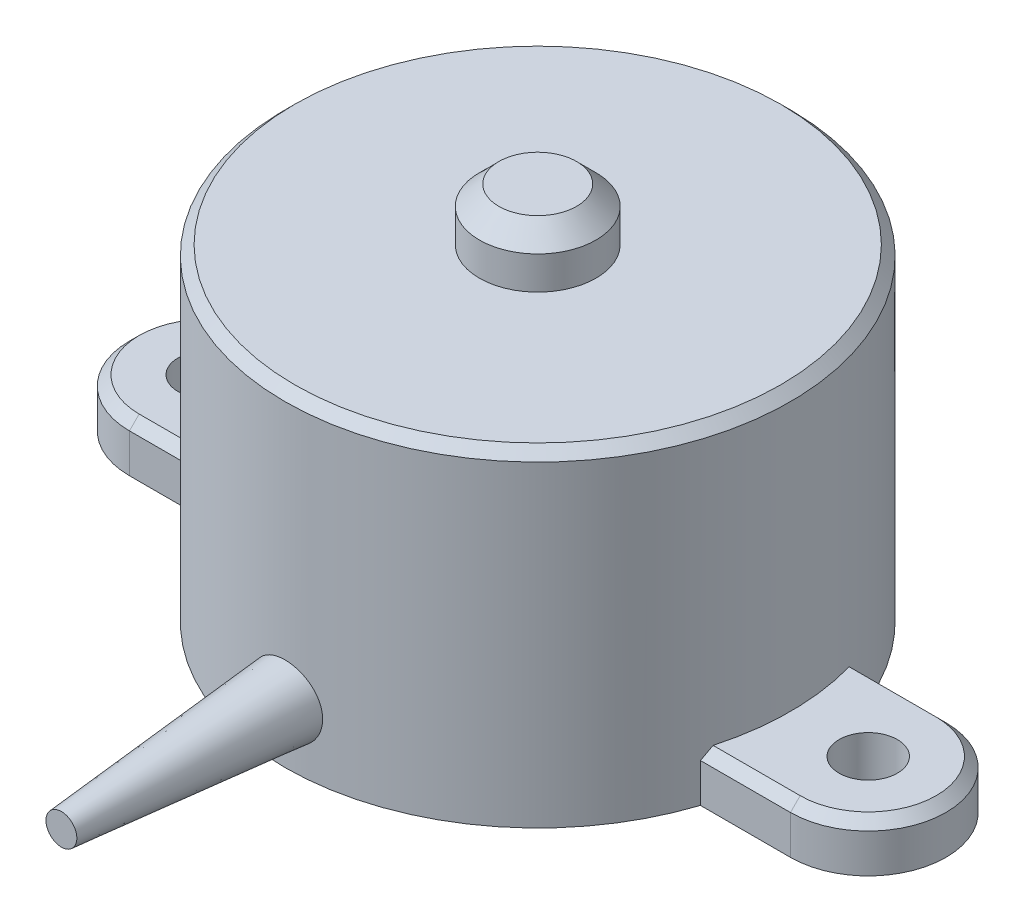
ISO-10303-21;
HEADER;
FILE_DESCRIPTION(('STEP AP214'),'2;1');
FILE_NAME('part.step','',(''),(''),'','','');
FILE_SCHEMA(('AUTOMOTIVE_DESIGN { 1 0 10303 214 1 1 1 1 }'));
ENDSEC;
DATA;
#1=APPLICATION_CONTEXT('core data for automotive mechanical design processes');
#2=APPLICATION_PROTOCOL_DEFINITION('international standard','automotive_design',2000,#1);
#3=PRODUCT_CONTEXT('',#1,'mechanical');
#4=PRODUCT('Part','Part','',(#3));
#5=PRODUCT_RELATED_PRODUCT_CATEGORY('part','',(#4));
#6=PRODUCT_DEFINITION_FORMATION('','',#4);
#7=PRODUCT_DEFINITION_CONTEXT('part definition',#1,'design');
#8=PRODUCT_DEFINITION('design','',#6,#7);
#9=PRODUCT_DEFINITION_SHAPE('','',#8);
#10=(LENGTH_UNIT() NAMED_UNIT(*) SI_UNIT(.MILLI.,.METRE.));
#11=(NAMED_UNIT(*) PLANE_ANGLE_UNIT() SI_UNIT($,.RADIAN.));
#12=(NAMED_UNIT(*) SI_UNIT($,.STERADIAN.) SOLID_ANGLE_UNIT());
#13=UNCERTAINTY_MEASURE_WITH_UNIT(LENGTH_MEASURE(1.E-05),#10,'distance_accuracy_value','');
#14=(GEOMETRIC_REPRESENTATION_CONTEXT(3) GLOBAL_UNCERTAINTY_ASSIGNED_CONTEXT((#13)) GLOBAL_UNIT_ASSIGNED_CONTEXT((#10,
#11,#12)) REPRESENTATION_CONTEXT('',''));
#15=CARTESIAN_POINT('',(0.,0.,0.));
#16=DIRECTION('',(0.,0.,1.));
#17=DIRECTION('',(1.,0.,0.));
#18=AXIS2_PLACEMENT_3D('',#15,#16,#17);
#19=CARTESIAN_POINT('',(0.,2.5,0.));
#20=DIRECTION('',(0.,-1.,0.));
#21=DIRECTION('',(0.,0.,-1.));
#22=AXIS2_PLACEMENT_3D('',#19,#20,#21);
#23=CYLINDRICAL_SURFACE('',#22,13.);
#24=CARTESIAN_POINT('',(0.,16.3,0.));
#25=DIRECTION('',(0.,1.,0.));
#26=DIRECTION('',(0.,0.,1.));
#27=AXIS2_PLACEMENT_3D('',#24,#25,#26);
#28=CIRCLE('',#27,13.);
#29=CARTESIAN_POINT('',(0.,16.3,13.));
#30=VERTEX_POINT('',#29);
#31=EDGE_CURVE('E278',#30,#30,#28,.F.);
#32=ORIENTED_EDGE('',*,*,#31,.T.);
#33=EDGE_LOOP('',(#32));
#34=FACE_BOUND('',#33,.T.);
#35=CARTESIAN_POINT('',(0.,0.,0.));
#36=DIRECTION('',(0.,1.,0.));
#37=DIRECTION('',(0.,0.,1.));
#38=AXIS2_PLACEMENT_3D('',#35,#36,#37);
#39=CIRCLE('',#38,13.);
#40=CARTESIAN_POINT('',(12.369316876853,0.,-4.00000000000001));
#41=VERTEX_POINT('',#40);
#42=CARTESIAN_POINT('',(-12.369316876853,0.,-4.00000000000001));
#43=VERTEX_POINT('',#42);
#44=EDGE_CURVE('E177',#41,#43,#39,.T.);
#45=ORIENTED_EDGE('',*,*,#44,.T.);
#46=DIRECTION('',(0.,-1.,0.));
#47=VECTOR('',#46,1.);
#48=CARTESIAN_POINT('',(-12.369316876853,2.5,-4.00000000000001));
#49=LINE('',#48,#47);
#50=CARTESIAN_POINT('',(-12.369316876853,2.,-4.00000000000001));
#51=VERTEX_POINT('',#50);
#52=EDGE_CURVE('E194',#51,#43,#49,.T.);
#53=ORIENTED_EDGE('',*,*,#52,.F.);
#54=CARTESIAN_POINT('',(0.,6.00000000000001,0.));
#55=DIRECTION('',(0.,-0.707106781186547,0.707106781186547));
#56=DIRECTION('',(0.,-0.707106781186548,-0.707106781186548));
#57=AXIS2_PLACEMENT_3D('',#54,#55,#56);
#58=ELLIPSE('',#57,18.3847763108502,13.);
#59=CARTESIAN_POINT('',(-12.5199840255489,2.5,-3.50000000000001));
#60=VERTEX_POINT('',#59);
#61=EDGE_CURVE('E298',#51,#60,#58,.F.);
#62=ORIENTED_EDGE('',*,*,#61,.T.);
#63=CARTESIAN_POINT('',(0.,2.5,0.));
#64=DIRECTION('',(0.,1.,0.));
#65=DIRECTION('',(0.,0.,1.));
#66=AXIS2_PLACEMENT_3D('',#63,#64,#65);
#67=CIRCLE('',#66,13.);
#68=CARTESIAN_POINT('',(-12.5199840255489,2.5,3.50000000000001));
#69=VERTEX_POINT('',#68);
#70=EDGE_CURVE('E144',#60,#69,#67,.T.);
#71=ORIENTED_EDGE('',*,*,#70,.T.);
#72=CARTESIAN_POINT('',(0.,6.,0.));
#73=DIRECTION('',(0.,0.707106781186547,0.707106781186547));
#74=DIRECTION('',(0.,-0.707106781186548,0.707106781186548));
#75=AXIS2_PLACEMENT_3D('',#72,#73,#74);
#76=ELLIPSE('',#75,18.3847763108502,13.);
#77=CARTESIAN_POINT('',(-12.369316876853,2.,4.00000000000001));
#78=VERTEX_POINT('',#77);
#79=EDGE_CURVE('E140',#69,#78,#76,.T.);
#80=ORIENTED_EDGE('',*,*,#79,.T.);
#81=DIRECTION('',(0.,-1.,0.));
#82=VECTOR('',#81,1.);
#83=CARTESIAN_POINT('',(-12.369316876853,2.5,4.00000000000001));
#84=LINE('',#83,#82);
#85=CARTESIAN_POINT('',(-12.369316876853,0.,4.00000000000001));
#86=VERTEX_POINT('',#85);
#87=EDGE_CURVE('E131',#78,#86,#84,.T.);
#88=ORIENTED_EDGE('',*,*,#87,.T.);
#89=CARTESIAN_POINT('',(0.,0.,0.));
#90=DIRECTION('',(0.,1.,0.));
#91=DIRECTION('',(0.,0.,1.));
#92=AXIS2_PLACEMENT_3D('',#89,#90,#91);
#93=CIRCLE('',#92,13.);
#94=CARTESIAN_POINT('',(12.369316876853,0.,4.));
#95=VERTEX_POINT('',#94);
#96=EDGE_CURVE('E136',#86,#95,#93,.T.);
#97=ORIENTED_EDGE('',*,*,#96,.T.);
#98=DIRECTION('',(0.,-1.,0.));
#99=VECTOR('',#98,1.);
#100=CARTESIAN_POINT('',(12.369316876853,2.5,4.));
#101=LINE('',#100,#99);
#102=CARTESIAN_POINT('',(12.369316876853,1.99999999999999,4.));
#103=VERTEX_POINT('',#102);
#104=EDGE_CURVE('E145',#103,#95,#101,.T.);
#105=ORIENTED_EDGE('',*,*,#104,.F.);
#106=CARTESIAN_POINT('',(0.,6.,0.));
#107=DIRECTION('',(0.,0.707106781186547,0.707106781186547));
#108=DIRECTION('',(0.,-0.707106781186548,0.707106781186548));
#109=AXIS2_PLACEMENT_3D('',#106,#107,#108);
#110=ELLIPSE('',#109,18.3847763108502,13.);
#111=CARTESIAN_POINT('',(12.5199840255489,2.5,3.49999999999999));
#112=VERTEX_POINT('',#111);
#113=EDGE_CURVE('E12',#103,#112,#110,.T.);
#114=ORIENTED_EDGE('',*,*,#113,.T.);
#115=CARTESIAN_POINT('',(12.5199840255489,2.5,-3.50000000000001));
#116=VERTEX_POINT('',#115);
#117=EDGE_CURVE('E161',#112,#116,#67,.T.);
#118=ORIENTED_EDGE('',*,*,#117,.T.);
#119=CARTESIAN_POINT('',(0.,6.,0.));
#120=DIRECTION('',(0.,-0.707106781186547,0.707106781186547));
#121=DIRECTION('',(0.,-0.707106781186548,-0.707106781186548));
#122=AXIS2_PLACEMENT_3D('',#119,#120,#121);
#123=ELLIPSE('',#122,18.3847763108502,13.);
#124=CARTESIAN_POINT('',(12.369316876853,1.99999999999999,-4.00000000000001));
#125=VERTEX_POINT('',#124);
#126=EDGE_CURVE('E49',#116,#125,#123,.F.);
#127=ORIENTED_EDGE('',*,*,#126,.T.);
#128=DIRECTION('',(0.,-1.,0.));
#129=VECTOR('',#128,1.);
#130=CARTESIAN_POINT('',(12.369316876853,2.5,-4.00000000000001));
#131=LINE('',#130,#129);
#132=EDGE_CURVE('E196',#125,#41,#131,.T.);
#133=ORIENTED_EDGE('',*,*,#132,.T.);
#134=EDGE_LOOP('',(#45,#53,#62,#71,#80,#88,#97,#105,#114,#118,#127,#133));
#135=FACE_BOUND('',#134,.T.);
#136=CARTESIAN_POINT('',(-1.31475038856711,1.76194250632725,12.9333457162392));
#137=CARTESIAN_POINT('',(-1.24453413818516,1.68829341015724,12.9404830194042));
#138=CARTESIAN_POINT('',(-1.16803537451405,1.62055137507789,12.9476799011518));
#139=CARTESIAN_POINT('',(-1.00464878226579,1.49880635362086,12.9613811311139));
#140=CARTESIAN_POINT('',(-0.917749964685769,1.44481809166313,12.9678847328271));
#141=CARTESIAN_POINT('',(-0.736072694313325,1.35215741029569,12.9794633131777));
#142=CARTESIAN_POINT('',(-0.64129665187527,1.31348032653778,12.9845387267572));
#143=CARTESIAN_POINT('',(-0.446552022629374,1.25253687014143,12.9926933287533));
#144=CARTESIAN_POINT('',(-0.346584789601646,1.23026624173872,12.995773034823));
#145=CARTESIAN_POINT('',(-0.144575339280441,1.20280360799879,12.9995873556045));
#146=CARTESIAN_POINT('',(-0.0425398064770174,1.19756337370248,13.0003285925328));
#147=CARTESIAN_POINT('',(0.160966685795537,1.20417996864695,12.9994016959588));
#148=CARTESIAN_POINT('',(0.262437632945213,1.21603716950244,12.9977335100875));
#149=CARTESIAN_POINT('',(0.461605864029953,1.25643962461517,12.9921830168118));
#150=CARTESIAN_POINT('',(0.559313895748892,1.28493290099185,12.9883076065966));
#151=CARTESIAN_POINT('',(0.74854697869634,1.3577543238032,12.9787773267409));
#152=CARTESIAN_POINT('',(0.840071835177299,1.40208296871819,12.9731224010839));
#153=CARTESIAN_POINT('',(1.01472179355157,1.50553764775454,12.9606343800261));
#154=CARTESIAN_POINT('',(1.09781360229894,1.56471935524729,12.9537968826905));
#155=CARTESIAN_POINT('',(1.25287342482025,1.69616734326105,12.9397210417983));
#156=CARTESIAN_POINT('',(1.3248411317109,1.76843398463991,12.9324826871908));
#157=CARTESIAN_POINT('',(1.45576767588471,1.92426750507328,12.9184015287051));
#158=CARTESIAN_POINT('',(1.51469414114075,2.00786169188798,12.9115597395782));
#159=CARTESIAN_POINT('',(1.61757421145671,2.18388894856321,12.8990755679398));
#160=CARTESIAN_POINT('',(1.66152862122695,2.27632154303946,12.8934331209727));
#161=CARTESIAN_POINT('',(1.73281415261911,2.46657867588129,12.8840461406357));
#162=CARTESIAN_POINT('',(1.7602842140799,2.56435034557211,12.8802857898686));
#163=CARTESIAN_POINT('',(1.79832419165998,2.76318468308513,12.8750302873632));
#164=CARTESIAN_POINT('',(1.80889563101364,2.86424705344699,12.8735349314599));
#165=CARTESIAN_POINT('',(1.81277909368837,3.06540244724778,12.8729885662567));
#166=CARTESIAN_POINT('',(1.80631159895966,3.16549119650108,12.8739063311325));
#167=CARTESIAN_POINT('',(1.77678814702431,3.36314019403958,12.8780139124586));
#168=CARTESIAN_POINT('',(1.75373239455063,3.46070047351587,12.8812037008676));
#169=CARTESIAN_POINT('',(1.69178862290336,3.65040178948997,12.8894847832485));
#170=CARTESIAN_POINT('',(1.65292458534083,3.74255079378988,12.8945731959916));
#171=CARTESIAN_POINT('',(1.56051425491498,3.91907438566922,12.9060820443122));
#172=CARTESIAN_POINT('',(1.50696699375375,4.00344846003371,12.91250256773));
#173=CARTESIAN_POINT('',(1.38600540435735,4.16309774489147,12.9260482999541));
#174=CARTESIAN_POINT('',(1.31843617878263,4.23825496386234,12.9331808739152));
#175=CARTESIAN_POINT('',(1.17172314344795,4.37628423343485,12.9472964507662));
#176=CARTESIAN_POINT('',(1.09257862157693,4.43915552765131,12.9542794444235));
#177=CARTESIAN_POINT('',(0.924006061910707,4.55150982773174,12.9673984865344));
#178=CARTESIAN_POINT('',(0.834477989177908,4.60084398634017,12.9735247817366));
#179=CARTESIAN_POINT('',(0.648344102353951,4.68385033311967,12.9841569068769));
#180=CARTESIAN_POINT('',(0.551738352374463,4.71752266313987,12.9886627514912));
#181=CARTESIAN_POINT('',(0.354226111744259,4.76823155819282,12.9955483852231));
#182=CARTESIAN_POINT('',(0.253321568846864,4.78527557546834,12.9979291266985));
#183=CARTESIAN_POINT('',(0.0500568737066249,4.80225596732741,13.0003008422991));
#184=CARTESIAN_POINT('',(-0.0523032356521488,4.80219284488362,13.0002918866844));
#185=CARTESIAN_POINT('',(-0.255076883726284,4.7850022061351,12.9978910815437));
#186=CARTESIAN_POINT('',(-0.355497188735518,4.76795281474207,12.9955101414838));
#187=CARTESIAN_POINT('',(-0.552031215831112,4.71739948984421,12.9886464196993));
#188=CARTESIAN_POINT('',(-0.648144863007942,4.68389527024708,12.9841636014303));
#189=CARTESIAN_POINT('',(-0.833524591741551,4.60131283259096,12.9735839063974));
#190=CARTESIAN_POINT('',(-0.922779050530567,4.55220887352798,12.9674843646669));
#191=CARTESIAN_POINT('',(-1.09177781026267,4.43980601445219,12.9543512311985));
#192=CARTESIAN_POINT('',(-1.17152170213063,4.3765065041875,12.9473175993104));
#193=CARTESIAN_POINT('',(-1.31959336295848,4.23713323804793,12.9330677521985));
#194=CARTESIAN_POINT('',(-1.38786904958826,4.1610041909946,12.9258508667212));
#195=CARTESIAN_POINT('',(-1.51060526742673,3.99826582543415,12.9120833897239));
#196=CARTESIAN_POINT('',(-1.56506608845421,3.91165672684185,12.9055327842278));
#197=CARTESIAN_POINT('',(-1.65834082747281,3.73078737066046,12.8938789882032));
#198=CARTESIAN_POINT('',(-1.69722394631566,3.63656323739883,12.8887694267938));
#199=CARTESIAN_POINT('',(-1.75849118844204,3.44281662874844,12.8805540593318));
#200=CARTESIAN_POINT('',(-1.7808773583119,3.34329481222528,12.8774480047332));
#201=CARTESIAN_POINT('',(-1.80826190732673,3.1431916507331,12.8736311824033));
#202=CARTESIAN_POINT('',(-1.81348719241104,3.04264191547847,12.8728891607444));
#203=CARTESIAN_POINT('',(-1.80702137239353,2.84207967485127,12.8737983493125));
#204=CARTESIAN_POINT('',(-1.79532760877869,2.74206725638666,12.8754499356506));
#205=CARTESIAN_POINT('',(-1.75552058593872,2.54610294876296,12.8809371788227));
#206=CARTESIAN_POINT('',(-1.7275117231391,2.45012936511238,12.8847589453166));
#207=CARTESIAN_POINT('',(-1.65601716918133,2.26429923446658,12.8941419684463));
#208=CARTESIAN_POINT('',(-1.61254600162522,2.17443704113159,12.8997015921368));
#209=CARTESIAN_POINT('',(-1.52717750720477,2.02986748479932,12.9100329183076));
#210=CARTESIAN_POINT('',(-1.48898811123127,1.97291268799441,12.9145126846453));
#211=CARTESIAN_POINT('',(-1.40639744814203,1.8637279293687,12.9237678787157));
#212=CARTESIAN_POINT('',(-1.36199609257459,1.81149803484294,12.9285433106577));
#213=CARTESIAN_POINT('',(-1.31475038856711,1.76194250632725,12.9333457162392));
#214=B_SPLINE_CURVE_WITH_KNOTS('',3,(#136,#137,#138,#139,#140,#141,#142,#143,#144,#145,#146,
#147,#148,#149,#150,#151,#152,#153,#154,#155,#156,#157,#158,#159,#160,#161,#162,#163,#164,#165,
#166,#167,#168,#169,#170,#171,#172,#173,#174,#175,#176,#177,#178,#179,#180,#181,#182,#183,#184,
#185,#186,#187,#188,#189,#190,#191,#192,#193,#194,#195,#196,#197,#198,#199,#200,#201,#202,#203,
#204,#205,#206,#207,#208,#209,#210,#211,#212,#213),.UNSPECIFIED.,.T.,.F.,(4,2,2,2,2,2,2,2,2,2,2,
2,2,2,2,2,2,2,2,2,2,2,2,2,2,2,2,2,2,2,2,2,2,2,2,2,2,2,4),(0.,0.305772103404281,
0.611870195439234,0.917874966843123,1.22380033394327,1.52885858206519,1.83392346076268,
2.13804025471003,2.44216662276973,2.74745042504804,3.05274264776181,3.35878439717764,
3.66480969502288,3.96821801570118,4.2715989857444,4.57107358021798,4.87054447862705,
5.16956275566139,5.46860075645958,5.77113709267685,6.0736920487342,6.37945135746073,
6.68520789687239,6.99082734359548,7.29643780470158,7.60064913108605,7.90486574683627,
8.20958697834245,8.51432131200691,8.82040420950645,9.12648068523462,9.43118198521186,
9.73584547804397,10.0364640544152,10.3371298725205,10.6358926127952,10.9343754658091,
11.140114343817,11.3458561516265),.UNSPECIFIED.);
#215=CARTESIAN_POINT('',(-1.31475038856711,1.76194250632725,12.9333457162392));
#216=VERTEX_POINT('',#215);
#217=EDGE_CURVE('E210',#216,#216,#214,.T.);
#218=ORIENTED_EDGE('',*,*,#217,.F.);
#219=EDGE_LOOP('',(#218));
#220=FACE_BOUND('',#219,.T.);
#221=ADVANCED_FACE('F39',(#34,#135,#220),#23,.T.);
#222=CARTESIAN_POINT('',(0.,2.5,0.));
#223=DIRECTION('',(0.,1.,0.));
#224=DIRECTION('',(0.,0.,1.));
#225=AXIS2_PLACEMENT_3D('',#222,#223,#224);
#226=PLANE('',#225);
#227=CARTESIAN_POINT('',(17.,2.5,0.));
#228=DIRECTION('',(0.,1.,0.));
#229=DIRECTION('',(0.,0.,1.));
#230=AXIS2_PLACEMENT_3D('',#227,#228,#229);
#231=CIRCLE('',#230,3.5);
#232=CARTESIAN_POINT('',(17.,2.5,3.49999999999999));
#233=VERTEX_POINT('',#232);
#234=CARTESIAN_POINT('',(17.,2.5,-3.50000000000001));
#235=VERTEX_POINT('',#234);
#236=EDGE_CURVE('E65',#233,#235,#231,.T.);
#237=ORIENTED_EDGE('',*,*,#236,.T.);
#238=DIRECTION('',(-1.,0.,0.));
#239=VECTOR('',#238,1.);
#240=CARTESIAN_POINT('',(0.,2.5,-3.5));
#241=LINE('',#240,#239);
#242=EDGE_CURVE('E293',#235,#116,#241,.T.);
#243=ORIENTED_EDGE('',*,*,#242,.T.);
#244=ORIENTED_EDGE('',*,*,#117,.F.);
#245=DIRECTION('',(1.,0.,0.));
#246=VECTOR('',#245,1.);
#247=CARTESIAN_POINT('',(17.,2.5,3.49999999999999));
#248=LINE('',#247,#246);
#249=EDGE_CURVE('E284',#112,#233,#248,.T.);
#250=ORIENTED_EDGE('',*,*,#249,.T.);
#251=EDGE_LOOP('',(#237,#243,#244,#250));
#252=FACE_BOUND('',#251,.T.);
#253=CARTESIAN_POINT('',(17.,2.5,0.));
#254=DIRECTION('',(0.,1.,0.));
#255=DIRECTION('',(0.,0.,1.));
#256=AXIS2_PLACEMENT_3D('',#253,#254,#255);
#257=CIRCLE('',#256,1.5);
#258=CARTESIAN_POINT('',(17.,2.5,1.49999999999999));
#259=VERTEX_POINT('',#258);
#260=EDGE_CURVE('E167',#259,#259,#257,.T.);
#261=ORIENTED_EDGE('',*,*,#260,.F.);
#262=EDGE_LOOP('',(#261));
#263=FACE_BOUND('',#262,.T.);
#264=ADVANCED_FACE('F248',(#252,#263),#226,.T.);
#265=CARTESIAN_POINT('',(0.,2.5,4.));
#266=DIRECTION('',(0.,0.,-1.));
#267=DIRECTION('',(-1.,0.,0.));
#268=AXIS2_PLACEMENT_3D('',#265,#266,#267);
#269=PLANE('',#268);
#270=ORIENTED_EDGE('',*,*,#87,.F.);
#271=DIRECTION('',(-1.,0.,0.));
#272=VECTOR('',#271,1.);
#273=CARTESIAN_POINT('',(-17.,2.,4.00000000000001));
#274=LINE('',#273,#272);
#275=CARTESIAN_POINT('',(-17.,2.,4.00000000000001));
#276=VERTEX_POINT('',#275);
#277=EDGE_CURVE('E287',#78,#276,#274,.T.);
#278=ORIENTED_EDGE('',*,*,#277,.T.);
#279=DIRECTION('',(0.,-1.,0.));
#280=VECTOR('',#279,1.);
#281=CARTESIAN_POINT('',(-17.,2.5,4.00000000000001));
#282=LINE('',#281,#280);
#283=CARTESIAN_POINT('',(-17.,0.,4.00000000000001));
#284=VERTEX_POINT('',#283);
#285=EDGE_CURVE('E159',#276,#284,#282,.T.);
#286=ORIENTED_EDGE('',*,*,#285,.T.);
#287=DIRECTION('',(1.,0.,0.));
#288=VECTOR('',#287,1.);
#289=CARTESIAN_POINT('',(0.,0.,4.));
#290=LINE('',#289,#288);
#291=EDGE_CURVE('E152',#284,#86,#290,.T.);
#292=ORIENTED_EDGE('',*,*,#291,.T.);
#293=EDGE_LOOP('',(#270,#278,#286,#292));
#294=FACE_BOUND('',#293,.T.);
#295=ADVANCED_FACE('F157',(#294),#269,.F.);
#296=CARTESIAN_POINT('',(0.,2.5,4.));
#297=DIRECTION('',(0.,0.,-1.));
#298=DIRECTION('',(-1.,0.,0.));
#299=AXIS2_PLACEMENT_3D('',#296,#297,#298);
#300=PLANE('',#299);
#301=DIRECTION('',(0.,-1.,0.));
#302=VECTOR('',#301,1.);
#303=CARTESIAN_POINT('',(17.,2.5,4.));
#304=LINE('',#303,#302);
#305=CARTESIAN_POINT('',(17.,1.99999999999999,4.));
#306=VERTEX_POINT('',#305);
#307=CARTESIAN_POINT('',(17.,0.,4.));
#308=VERTEX_POINT('',#307);
#309=EDGE_CURVE('E200',#306,#308,#304,.T.);
#310=ORIENTED_EDGE('',*,*,#309,.F.);
#311=DIRECTION('',(-1.,0.,0.));
#312=VECTOR('',#311,1.);
#313=CARTESIAN_POINT('',(12.369316876853,1.99999999999999,4.));
#314=LINE('',#313,#312);
#315=EDGE_CURVE('E296',#306,#103,#314,.T.);
#316=ORIENTED_EDGE('',*,*,#315,.T.);
#317=ORIENTED_EDGE('',*,*,#104,.T.);
#318=DIRECTION('',(1.,0.,0.));
#319=VECTOR('',#318,1.);
#320=CARTESIAN_POINT('',(0.,0.,4.));
#321=LINE('',#320,#319);
#322=EDGE_CURVE('E155',#95,#308,#321,.T.);
#323=ORIENTED_EDGE('',*,*,#322,.T.);
#324=EDGE_LOOP('',(#310,#316,#317,#323));
#325=FACE_BOUND('',#324,.T.);
#326=ADVANCED_FACE('F320',(#325),#300,.F.);
#327=CARTESIAN_POINT('',(17.,2.5,0.));
#328=DIRECTION('',(0.,-1.,0.));
#329=DIRECTION('',(0.,0.,-1.));
#330=AXIS2_PLACEMENT_3D('',#327,#328,#329);
#331=CYLINDRICAL_SURFACE('',#330,4.00000000000001);
#332=DIRECTION('',(0.,-1.,0.));
#333=VECTOR('',#332,1.);
#334=CARTESIAN_POINT('',(17.,2.5,-4.00000000000001));
#335=LINE('',#334,#333);
#336=CARTESIAN_POINT('',(17.,1.99999999999999,-4.00000000000001));
#337=VERTEX_POINT('',#336);
#338=CARTESIAN_POINT('',(17.,0.,-4.00000000000001));
#339=VERTEX_POINT('',#338);
#340=EDGE_CURVE('E198',#337,#339,#335,.T.);
#341=ORIENTED_EDGE('',*,*,#340,.F.);
#342=CARTESIAN_POINT('',(17.,1.99999999999999,0.));
#343=DIRECTION('',(0.,1.,0.));
#344=DIRECTION('',(0.,0.,1.));
#345=AXIS2_PLACEMENT_3D('',#342,#343,#344);
#346=CIRCLE('',#345,4.00000000000001);
#347=EDGE_CURVE('E57',#337,#306,#346,.F.);
#348=ORIENTED_EDGE('',*,*,#347,.T.);
#349=ORIENTED_EDGE('',*,*,#309,.T.);
#350=CARTESIAN_POINT('',(17.,0.,0.));
#351=DIRECTION('',(0.,1.,0.));
#352=DIRECTION('',(0.,0.,1.));
#353=AXIS2_PLACEMENT_3D('',#350,#351,#352);
#354=CIRCLE('',#353,4.00000000000001);
#355=EDGE_CURVE('E171',#308,#339,#354,.T.);
#356=ORIENTED_EDGE('',*,*,#355,.T.);
#357=EDGE_LOOP('',(#341,#348,#349,#356));
#358=FACE_BOUND('',#357,.T.);
#359=ADVANCED_FACE('F268',(#358),#331,.T.);
#360=CARTESIAN_POINT('',(0.,2.5,-4.00000000000001));
#361=DIRECTION('',(0.,0.,-1.));
#362=DIRECTION('',(-1.,0.,0.));
#363=AXIS2_PLACEMENT_3D('',#360,#361,#362);
#364=PLANE('',#363);
#365=ORIENTED_EDGE('',*,*,#132,.F.);
#366=DIRECTION('',(1.,0.,0.));
#367=VECTOR('',#366,1.);
#368=CARTESIAN_POINT('',(0.,1.99999999999999,-4.00000000000001));
#369=LINE('',#368,#367);
#370=EDGE_CURVE('E280',#125,#337,#369,.T.);
#371=ORIENTED_EDGE('',*,*,#370,.T.);
#372=ORIENTED_EDGE('',*,*,#340,.T.);
#373=DIRECTION('',(1.,0.,0.));
#374=VECTOR('',#373,1.);
#375=CARTESIAN_POINT('',(0.,0.,-4.00000000000001));
#376=LINE('',#375,#374);
#377=EDGE_CURVE('E174',#41,#339,#376,.T.);
#378=ORIENTED_EDGE('',*,*,#377,.F.);
#379=EDGE_LOOP('',(#365,#371,#372,#378));
#380=FACE_BOUND('',#379,.T.);
#381=ADVANCED_FACE('F263',(#380),#364,.T.);
#382=CARTESIAN_POINT('',(0.,2.5,-4.00000000000001));
#383=DIRECTION('',(0.,0.,-1.));
#384=DIRECTION('',(-1.,0.,0.));
#385=AXIS2_PLACEMENT_3D('',#382,#383,#384);
#386=PLANE('',#385);
#387=DIRECTION('',(0.,-1.,0.));
#388=VECTOR('',#387,1.);
#389=CARTESIAN_POINT('',(-17.,2.5,-4.00000000000001));
#390=LINE('',#389,#388);
#391=CARTESIAN_POINT('',(-17.,2.,-4.00000000000001));
#392=VERTEX_POINT('',#391);
#393=CARTESIAN_POINT('',(-17.,0.,-4.00000000000001));
#394=VERTEX_POINT('',#393);
#395=EDGE_CURVE('E192',#392,#394,#390,.T.);
#396=ORIENTED_EDGE('',*,*,#395,.F.);
#397=DIRECTION('',(1.,0.,0.));
#398=VECTOR('',#397,1.);
#399=CARTESIAN_POINT('',(0.,2.,-4.00000000000001));
#400=LINE('',#399,#398);
#401=EDGE_CURVE('E218',#392,#51,#400,.T.);
#402=ORIENTED_EDGE('',*,*,#401,.T.);
#403=ORIENTED_EDGE('',*,*,#52,.T.);
#404=DIRECTION('',(1.,0.,0.));
#405=VECTOR('',#404,1.);
#406=CARTESIAN_POINT('',(0.,0.,-4.00000000000001));
#407=LINE('',#406,#405);
#408=EDGE_CURVE('E179',#394,#43,#407,.T.);
#409=ORIENTED_EDGE('',*,*,#408,.F.);
#410=EDGE_LOOP('',(#396,#402,#403,#409));
#411=FACE_BOUND('',#410,.T.);
#412=ADVANCED_FACE('F258',(#411),#386,.T.);
#413=CARTESIAN_POINT('',(-17.,2.5,0.));
#414=DIRECTION('',(0.,-1.,0.));
#415=DIRECTION('',(0.,0.,-1.));
#416=AXIS2_PLACEMENT_3D('',#413,#414,#415);
#417=CYLINDRICAL_SURFACE('',#416,1.5);
#418=CARTESIAN_POINT('',(-17.,2.5,0.));
#419=DIRECTION('',(0.,1.,0.));
#420=DIRECTION('',(0.,0.,1.));
#421=AXIS2_PLACEMENT_3D('',#418,#419,#420);
#422=CIRCLE('',#421,1.5);
#423=CARTESIAN_POINT('',(-17.,2.5,1.5));
#424=VERTEX_POINT('',#423);
#425=EDGE_CURVE('E190',#424,#424,#422,.T.);
#426=ORIENTED_EDGE('',*,*,#425,.T.);
#427=EDGE_LOOP('',(#426));
#428=FACE_BOUND('',#427,.T.);
#429=CARTESIAN_POINT('',(-17.,0.,0.));
#430=DIRECTION('',(0.,1.,0.));
#431=DIRECTION('',(0.,0.,1.));
#432=AXIS2_PLACEMENT_3D('',#429,#430,#431);
#433=CIRCLE('',#432,1.5);
#434=CARTESIAN_POINT('',(-17.,0.,1.5));
#435=VERTEX_POINT('',#434);
#436=EDGE_CURVE('E184',#435,#435,#433,.T.);
#437=ORIENTED_EDGE('',*,*,#436,.F.);
#438=EDGE_LOOP('',(#437));
#439=FACE_BOUND('',#438,.T.);
#440=ADVANCED_FACE('F255',(#428,#439),#417,.F.);
#441=CARTESIAN_POINT('',(-17.,2.5,0.));
#442=DIRECTION('',(0.,-1.,0.));
#443=DIRECTION('',(0.,0.,-1.));
#444=AXIS2_PLACEMENT_3D('',#441,#442,#443);
#445=CYLINDRICAL_SURFACE('',#444,4.00000000000001);
#446=ORIENTED_EDGE('',*,*,#285,.F.);
#447=CARTESIAN_POINT('',(-17.,2.,0.));
#448=DIRECTION('',(0.,1.,0.));
#449=DIRECTION('',(0.,0.,1.));
#450=AXIS2_PLACEMENT_3D('',#447,#448,#449);
#451=CIRCLE('',#450,4.00000000000001);
#452=EDGE_CURVE('E342',#276,#392,#451,.F.);
#453=ORIENTED_EDGE('',*,*,#452,.T.);
#454=ORIENTED_EDGE('',*,*,#395,.T.);
#455=CARTESIAN_POINT('',(-17.,0.,0.));
#456=DIRECTION('',(0.,1.,0.));
#457=DIRECTION('',(0.,0.,1.));
#458=AXIS2_PLACEMENT_3D('',#455,#456,#457);
#459=CIRCLE('',#458,4.00000000000001);
#460=EDGE_CURVE('E182',#394,#284,#459,.T.);
#461=ORIENTED_EDGE('',*,*,#460,.T.);
#462=EDGE_LOOP('',(#446,#453,#454,#461));
#463=FACE_BOUND('',#462,.T.);
#464=ADVANCED_FACE('F253',(#463),#445,.T.);
#465=CARTESIAN_POINT('',(17.,2.5,0.));
#466=DIRECTION('',(0.,-1.,0.));
#467=DIRECTION('',(0.,0.,-1.));
#468=AXIS2_PLACEMENT_3D('',#465,#466,#467);
#469=CYLINDRICAL_SURFACE('',#468,1.5);
#470=ORIENTED_EDGE('',*,*,#260,.T.);
#471=EDGE_LOOP('',(#470));
#472=FACE_BOUND('',#471,.T.);
#473=CARTESIAN_POINT('',(17.,0.,0.));
#474=DIRECTION('',(0.,1.,0.));
#475=DIRECTION('',(0.,0.,1.));
#476=AXIS2_PLACEMENT_3D('',#473,#474,#475);
#477=CIRCLE('',#476,1.5);
#478=CARTESIAN_POINT('',(17.,0.,1.49999999999999));
#479=VERTEX_POINT('',#478);
#480=EDGE_CURVE('E187',#479,#479,#477,.T.);
#481=ORIENTED_EDGE('',*,*,#480,.F.);
#482=EDGE_LOOP('',(#481));
#483=FACE_BOUND('',#482,.T.);
#484=ADVANCED_FACE('F246',(#472,#483),#469,.F.);
#485=ORIENTED_EDGE('',*,*,#70,.F.);
#486=DIRECTION('',(-1.,0.,0.));
#487=VECTOR('',#486,1.);
#488=CARTESIAN_POINT('',(0.,2.5,-3.50000000000001));
#489=LINE('',#488,#487);
#490=CARTESIAN_POINT('',(-17.,2.5,-3.50000000000001));
#491=VERTEX_POINT('',#490);
#492=EDGE_CURVE('E338',#60,#491,#489,.T.);
#493=ORIENTED_EDGE('',*,*,#492,.T.);
#494=CARTESIAN_POINT('',(-17.,2.5,0.));
#495=DIRECTION('',(0.,1.,0.));
#496=DIRECTION('',(0.,0.,1.));
#497=AXIS2_PLACEMENT_3D('',#494,#495,#496);
#498=CIRCLE('',#497,3.50000000000001);
#499=CARTESIAN_POINT('',(-17.,2.5,3.50000000000001));
#500=VERTEX_POINT('',#499);
#501=EDGE_CURVE('E336',#491,#500,#498,.T.);
#502=ORIENTED_EDGE('',*,*,#501,.T.);
#503=DIRECTION('',(1.,0.,0.));
#504=VECTOR('',#503,1.);
#505=CARTESIAN_POINT('',(-12.369316876853,2.5,3.50000000000001));
#506=LINE('',#505,#504);
#507=EDGE_CURVE('E335',#500,#69,#506,.T.);
#508=ORIENTED_EDGE('',*,*,#507,.T.);
#509=EDGE_LOOP('',(#485,#493,#502,#508));
#510=FACE_BOUND('',#509,.T.);
#511=ORIENTED_EDGE('',*,*,#425,.F.);
#512=EDGE_LOOP('',(#511));
#513=FACE_BOUND('',#512,.T.);
#514=ADVANCED_FACE('F243',(#510,#513),#226,.T.);
#515=CARTESIAN_POINT('',(0.,0.,0.));
#516=DIRECTION('',(0.,1.,0.));
#517=DIRECTION('',(0.,0.,1.));
#518=AXIS2_PLACEMENT_3D('',#515,#516,#517);
#519=PLANE('',#518);
#520=ORIENTED_EDGE('',*,*,#291,.F.);
#521=ORIENTED_EDGE('',*,*,#460,.F.);
#522=ORIENTED_EDGE('',*,*,#408,.T.);
#523=ORIENTED_EDGE('',*,*,#44,.F.);
#524=ORIENTED_EDGE('',*,*,#377,.T.);
#525=ORIENTED_EDGE('',*,*,#355,.F.);
#526=ORIENTED_EDGE('',*,*,#322,.F.);
#527=ORIENTED_EDGE('',*,*,#96,.F.);
#528=EDGE_LOOP('',(#520,#521,#522,#523,#524,#525,#526,#527));
#529=FACE_BOUND('',#528,.T.);
#530=ORIENTED_EDGE('',*,*,#436,.T.);
#531=EDGE_LOOP('',(#530));
#532=FACE_BOUND('',#531,.T.);
#533=ORIENTED_EDGE('',*,*,#480,.T.);
#534=EDGE_LOOP('',(#533));
#535=FACE_BOUND('',#534,.T.);
#536=ADVANCED_FACE('F149',(#529,#532,#535),#519,.F.);
#537=CARTESIAN_POINT('',(0.,16.8,0.));
#538=DIRECTION('',(0.,1.,0.));
#539=DIRECTION('',(0.,0.,1.));
#540=AXIS2_PLACEMENT_3D('',#537,#538,#539);
#541=PLANE('',#540);
#542=CARTESIAN_POINT('',(0.,16.8,0.));
#543=DIRECTION('',(0.,1.,0.));
#544=DIRECTION('',(0.,0.,1.));
#545=AXIS2_PLACEMENT_3D('',#542,#543,#544);
#546=CIRCLE('',#545,12.5);
#547=CARTESIAN_POINT('',(0.,16.8,12.5));
#548=VERTEX_POINT('',#547);
#549=EDGE_CURVE('E281',#548,#548,#546,.T.);
#550=ORIENTED_EDGE('',*,*,#549,.T.);
#551=EDGE_LOOP('',(#550));
#552=FACE_BOUND('',#551,.T.);
#553=CARTESIAN_POINT('',(0.,16.8,0.));
#554=DIRECTION('',(0.,1.,0.));
#555=DIRECTION('',(0.,0.,1.));
#556=AXIS2_PLACEMENT_3D('',#553,#554,#555);
#557=CIRCLE('',#556,3.);
#558=CARTESIAN_POINT('',(0.,16.8,3.));
#559=VERTEX_POINT('',#558);
#560=EDGE_CURVE('E207',#559,#559,#557,.T.);
#561=ORIENTED_EDGE('',*,*,#560,.F.);
#562=EDGE_LOOP('',(#561));
#563=FACE_BOUND('',#562,.T.);
#564=ADVANCED_FACE('F235',(#552,#563),#541,.T.);
#565=CARTESIAN_POINT('',(0.,47.4852813742386,0.));
#566=DIRECTION('',(0.,-1.,0.));
#567=DIRECTION('',(0.,0.,-1.));
#568=AXIS2_PLACEMENT_3D('',#565,#566,#567);
#569=CYLINDRICAL_SURFACE('',#568,3.);
#570=CARTESIAN_POINT('',(0.,18.5,0.));
#571=DIRECTION('',(0.,1.,0.));
#572=DIRECTION('',(0.,0.,1.));
#573=AXIS2_PLACEMENT_3D('',#570,#571,#572);
#574=CIRCLE('',#573,3.);
#575=CARTESIAN_POINT('',(0.,18.5,3.));
#576=VERTEX_POINT('',#575);
#577=EDGE_CURVE('E206',#576,#576,#574,.F.);
#578=ORIENTED_EDGE('',*,*,#577,.T.);
#579=EDGE_LOOP('',(#578));
#580=FACE_BOUND('',#579,.T.);
#581=ORIENTED_EDGE('',*,*,#560,.T.);
#582=EDGE_LOOP('',(#581));
#583=FACE_BOUND('',#582,.T.);
#584=ADVANCED_FACE('F231',(#580,#583),#569,.T.);
#585=CARTESIAN_POINT('',(0.,19.5,0.));
#586=DIRECTION('',(0.,1.,0.));
#587=DIRECTION('',(0.,0.,1.));
#588=AXIS2_PLACEMENT_3D('',#585,#586,#587);
#589=PLANE('',#588);
#590=CARTESIAN_POINT('',(0.,19.5,0.));
#591=DIRECTION('',(0.,1.,0.));
#592=DIRECTION('',(0.,0.,1.));
#593=AXIS2_PLACEMENT_3D('',#590,#591,#592);
#594=CIRCLE('',#593,2.);
#595=CARTESIAN_POINT('',(0.,19.5,2.));
#596=VERTEX_POINT('',#595);
#597=EDGE_CURVE('E203',#596,#596,#594,.T.);
#598=ORIENTED_EDGE('',*,*,#597,.T.);
#599=EDGE_LOOP('',(#598));
#600=FACE_BOUND('',#599,.T.);
#601=ADVANCED_FACE('F234',(#600),#589,.T.);
#602=CARTESIAN_POINT('',(0.,19.5,0.));
#603=DIRECTION('',(0.,-1.,0.));
#604=DIRECTION('',(0.,0.,-1.));
#605=AXIS2_PLACEMENT_3D('',#602,#603,#604);
#606=CONICAL_SURFACE('',#605,2.,0.785398163397446);
#607=ORIENTED_EDGE('',*,*,#577,.F.);
#608=EDGE_LOOP('',(#607));
#609=FACE_BOUND('',#608,.T.);
#610=ORIENTED_EDGE('',*,*,#597,.F.);
#611=EDGE_LOOP('',(#610));
#612=FACE_BOUND('',#611,.T.);
#613=ADVANCED_FACE('F229',(#609,#612),#606,.T.);
#614=CARTESIAN_POINT('',(0.,3.,5.));
#615=DIRECTION('',(0.,0.,-1.));
#616=DIRECTION('',(1.,0.,0.));
#617=AXIS2_PLACEMENT_3D('',#614,#615,#616);
#618=CONICAL_SURFACE('',#617,2.5,0.0872664625997165);
#619=CARTESIAN_POINT('',(0.,3.,24.5));
#620=DIRECTION('',(0.,0.,1.));
#621=DIRECTION('',(1.,0.,0.));
#622=AXIS2_PLACEMENT_3D('',#619,#620,#621);
#623=CIRCLE('',#622,0.793971061244482);
#624=CARTESIAN_POINT('',(0.793971061244482,3.,24.5));
#625=VERTEX_POINT('',#624);
#626=EDGE_CURVE('E164',#625,#625,#623,.T.);
#627=ORIENTED_EDGE('',*,*,#626,.F.);
#628=EDGE_LOOP('',(#627));
#629=FACE_BOUND('',#628,.T.);
#630=ORIENTED_EDGE('',*,*,#217,.T.);
#631=EDGE_LOOP('',(#630));
#632=FACE_BOUND('',#631,.T.);
#633=ADVANCED_FACE('F223',(#629,#632),#618,.T.);
#634=CARTESIAN_POINT('',(0.,3.,24.5));
#635=DIRECTION('',(0.,0.,1.));
#636=DIRECTION('',(1.,0.,0.));
#637=AXIS2_PLACEMENT_3D('',#634,#635,#636);
#638=PLANE('',#637);
#639=ORIENTED_EDGE('',*,*,#626,.T.);
#640=EDGE_LOOP('',(#639));
#641=FACE_BOUND('',#640,.T.);
#642=ADVANCED_FACE('F228',(#641),#638,.T.);
#643=CARTESIAN_POINT('',(0.,2.5,3.5));
#644=DIRECTION('',(0.,0.707106781186547,0.707106781186547));
#645=DIRECTION('',(-1.,0.,0.));
#646=AXIS2_PLACEMENT_3D('',#643,#644,#645);
#647=PLANE('',#646);
#648=ORIENTED_EDGE('',*,*,#79,.F.);
#649=ORIENTED_EDGE('',*,*,#507,.F.);
#650=DIRECTION('',(0.,0.707106781186547,-0.707106781186548));
#651=VECTOR('',#650,1.);
#652=CARTESIAN_POINT('',(-17.,2.,4.00000000000001));
#653=LINE('',#652,#651);
#654=EDGE_CURVE('E305',#276,#500,#653,.T.);
#655=ORIENTED_EDGE('',*,*,#654,.F.);
#656=ORIENTED_EDGE('',*,*,#277,.F.);
#657=EDGE_LOOP('',(#648,#649,#655,#656));
#658=FACE_BOUND('',#657,.T.);
#659=ADVANCED_FACE('F346',(#658),#647,.T.);
#660=CARTESIAN_POINT('',(-17.,2.5,0.));
#661=DIRECTION('',(0.,-1.,0.));
#662=DIRECTION('',(0.,0.,-1.));
#663=AXIS2_PLACEMENT_3D('',#660,#661,#662);
#664=CONICAL_SURFACE('',#663,3.50000000000001,0.785398163397448);
#665=ORIENTED_EDGE('',*,*,#654,.T.);
#666=ORIENTED_EDGE('',*,*,#501,.F.);
#667=DIRECTION('',(0.,0.707106781186547,0.707106781186547));
#668=VECTOR('',#667,1.);
#669=CARTESIAN_POINT('',(-17.,2.,-4.00000000000001));
#670=LINE('',#669,#668);
#671=EDGE_CURVE('E302',#392,#491,#670,.T.);
#672=ORIENTED_EDGE('',*,*,#671,.F.);
#673=ORIENTED_EDGE('',*,*,#452,.F.);
#674=EDGE_LOOP('',(#665,#666,#672,#673));
#675=FACE_BOUND('',#674,.T.);
#676=ADVANCED_FACE('F349',(#675),#664,.T.);
#677=CARTESIAN_POINT('',(0.,2.,-4.00000000000001));
#678=DIRECTION('',(0.,-0.707106781186547,0.707106781186547));
#679=DIRECTION('',(1.,0.,0.));
#680=AXIS2_PLACEMENT_3D('',#677,#678,#679);
#681=PLANE('',#680);
#682=ORIENTED_EDGE('',*,*,#671,.T.);
#683=ORIENTED_EDGE('',*,*,#492,.F.);
#684=ORIENTED_EDGE('',*,*,#61,.F.);
#685=ORIENTED_EDGE('',*,*,#401,.F.);
#686=EDGE_LOOP('',(#682,#683,#684,#685));
#687=FACE_BOUND('',#686,.T.);
#688=ADVANCED_FACE('F351',(#687),#681,.F.);
#689=CARTESIAN_POINT('',(0.,16.8,0.));
#690=DIRECTION('',(0.,-1.,0.));
#691=DIRECTION('',(0.,0.,-1.));
#692=AXIS2_PLACEMENT_3D('',#689,#690,#691);
#693=CONICAL_SURFACE('',#692,12.5,0.785398163397445);
#694=ORIENTED_EDGE('',*,*,#31,.F.);
#695=EDGE_LOOP('',(#694));
#696=FACE_BOUND('',#695,.T.);
#697=ORIENTED_EDGE('',*,*,#549,.F.);
#698=EDGE_LOOP('',(#697));
#699=FACE_BOUND('',#698,.T.);
#700=ADVANCED_FACE('F387',(#696,#699),#693,.T.);
#701=CARTESIAN_POINT('',(0.,2.5,3.5));
#702=DIRECTION('',(0.,0.707106781186547,0.707106781186547));
#703=DIRECTION('',(-1.,0.,0.));
#704=AXIS2_PLACEMENT_3D('',#701,#702,#703);
#705=PLANE('',#704);
#706=ORIENTED_EDGE('',*,*,#113,.F.);
#707=ORIENTED_EDGE('',*,*,#315,.F.);
#708=DIRECTION('',(0.,-0.707106781186547,0.707106781186548));
#709=VECTOR('',#708,1.);
#710=CARTESIAN_POINT('',(17.,2.5,3.49999999999999));
#711=LINE('',#710,#709);
#712=EDGE_CURVE('E44',#233,#306,#711,.T.);
#713=ORIENTED_EDGE('',*,*,#712,.F.);
#714=ORIENTED_EDGE('',*,*,#249,.F.);
#715=EDGE_LOOP('',(#706,#707,#713,#714));
#716=FACE_BOUND('',#715,.T.);
#717=ADVANCED_FACE('F42',(#716),#705,.T.);
#718=CARTESIAN_POINT('',(17.,2.5,0.));
#719=DIRECTION('',(0.,-1.,0.));
#720=DIRECTION('',(0.,0.,-1.));
#721=AXIS2_PLACEMENT_3D('',#718,#719,#720);
#722=CONICAL_SURFACE('',#721,3.5,0.785398163397448);
#723=ORIENTED_EDGE('',*,*,#712,.T.);
#724=ORIENTED_EDGE('',*,*,#347,.F.);
#725=DIRECTION('',(0.,-0.707106781186547,-0.707106781186547));
#726=VECTOR('',#725,1.);
#727=CARTESIAN_POINT('',(17.,2.5,-3.50000000000001));
#728=LINE('',#727,#726);
#729=EDGE_CURVE('E307',#235,#337,#728,.T.);
#730=ORIENTED_EDGE('',*,*,#729,.F.);
#731=ORIENTED_EDGE('',*,*,#236,.F.);
#732=EDGE_LOOP('',(#723,#724,#730,#731));
#733=FACE_BOUND('',#732,.T.);
#734=ADVANCED_FACE('F314',(#733),#722,.T.);
#735=CARTESIAN_POINT('',(0.,1.99999999999999,-4.00000000000001));
#736=DIRECTION('',(0.,-0.707106781186547,0.707106781186547));
#737=DIRECTION('',(1.,0.,0.));
#738=AXIS2_PLACEMENT_3D('',#735,#736,#737);
#739=PLANE('',#738);
#740=ORIENTED_EDGE('',*,*,#126,.F.);
#741=ORIENTED_EDGE('',*,*,#242,.F.);
#742=ORIENTED_EDGE('',*,*,#729,.T.);
#743=ORIENTED_EDGE('',*,*,#370,.F.);
#744=EDGE_LOOP('',(#740,#741,#742,#743));
#745=FACE_BOUND('',#744,.T.);
#746=ADVANCED_FACE('F324',(#745),#739,.F.);
#747=CLOSED_SHELL('',(#221,#264,#295,#326,#359,#381,#412,#440,#464,#484,#514,#536,#564,#584,
#601,#613,#633,#642,#659,#676,#688,#700,#717,#734,#746));
#748=MANIFOLD_SOLID_BREP('B2',#747);
#749=ADVANCED_BREP_SHAPE_REPRESENTATION('',(#18,#748),#14);
#750=SHAPE_DEFINITION_REPRESENTATION(#9,#749);
ENDSEC;
END-ISO-10303-21;
